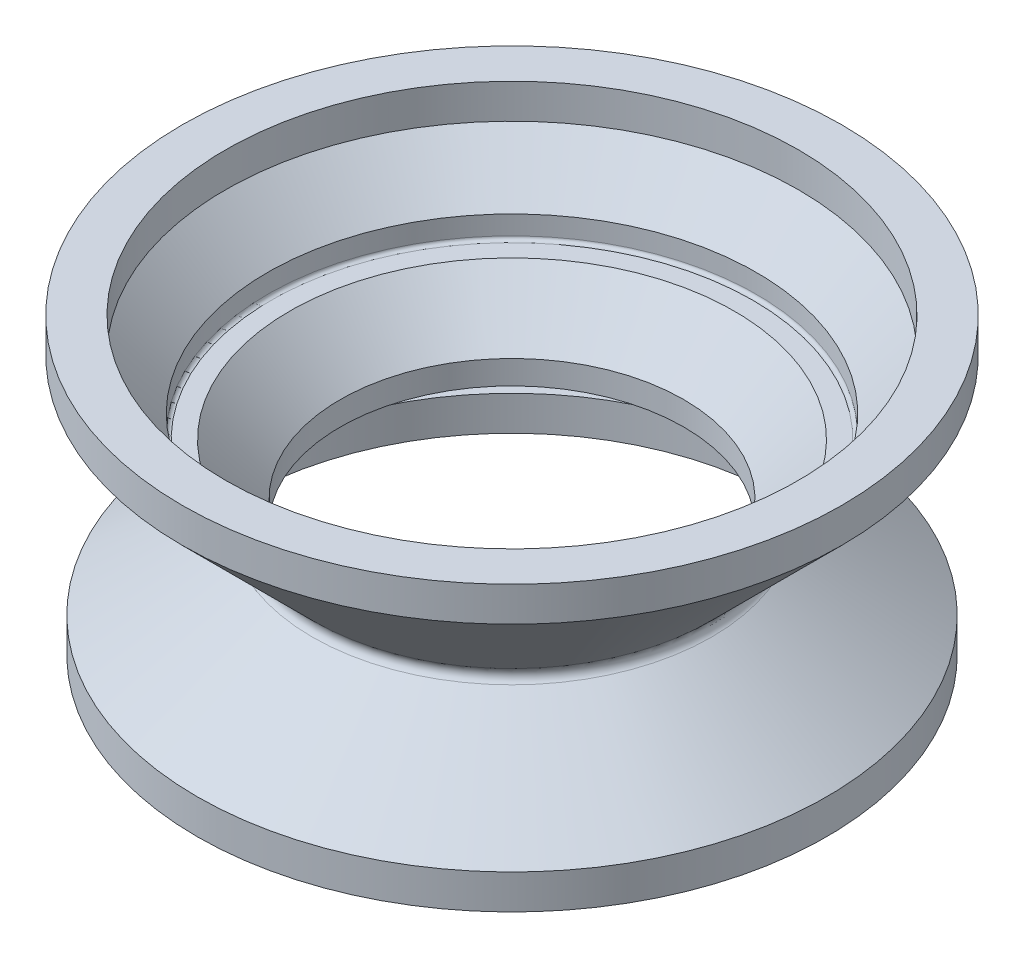
ISO-10303-21;
HEADER;
FILE_DESCRIPTION(('STEP AP214'),'2;1');
FILE_NAME('part.step','',(''),(''),'','','');
FILE_SCHEMA(('AUTOMOTIVE_DESIGN { 1 0 10303 214 1 1 1 1 }'));
ENDSEC;
DATA;
#1=APPLICATION_CONTEXT('core data for automotive mechanical design processes');
#2=APPLICATION_PROTOCOL_DEFINITION('international standard','automotive_design',2000,#1);
#3=PRODUCT_CONTEXT('',#1,'mechanical');
#4=PRODUCT('Part','Part','',(#3));
#5=PRODUCT_RELATED_PRODUCT_CATEGORY('part','',(#4));
#6=PRODUCT_DEFINITION_FORMATION('','',#4);
#7=PRODUCT_DEFINITION_CONTEXT('part definition',#1,'design');
#8=PRODUCT_DEFINITION('design','',#6,#7);
#9=PRODUCT_DEFINITION_SHAPE('','',#8);
#10=(LENGTH_UNIT() NAMED_UNIT(*) SI_UNIT(.MILLI.,.METRE.));
#11=(NAMED_UNIT(*) PLANE_ANGLE_UNIT() SI_UNIT($,.RADIAN.));
#12=(NAMED_UNIT(*) SI_UNIT($,.STERADIAN.) SOLID_ANGLE_UNIT());
#13=UNCERTAINTY_MEASURE_WITH_UNIT(LENGTH_MEASURE(1.E-05),#10,'distance_accuracy_value','');
#14=(GEOMETRIC_REPRESENTATION_CONTEXT(3) GLOBAL_UNCERTAINTY_ASSIGNED_CONTEXT((#13)) GLOBAL_UNIT_ASSIGNED_CONTEXT((#10,
#11,#12)) REPRESENTATION_CONTEXT('',''));
#15=CARTESIAN_POINT('',(0.,0.,0.));
#16=DIRECTION('',(0.,0.,1.));
#17=DIRECTION('',(1.,0.,0.));
#18=AXIS2_PLACEMENT_3D('',#15,#16,#17);
#19=CARTESIAN_POINT('',(0.,8.,0.));
#20=DIRECTION('',(0.,1.,0.));
#21=DIRECTION('',(0.,0.,1.));
#22=AXIS2_PLACEMENT_3D('',#19,#20,#21);
#23=CONICAL_SURFACE('',#22,19.0420064994615,0.785398163397454);
#24=CARTESIAN_POINT('',(0.,0.421348523413396,0.));
#25=DIRECTION('',(0.,1.,0.));
#26=DIRECTION('',(0.,0.,1.));
#27=AXIS2_PLACEMENT_3D('',#24,#25,#26);
#28=CIRCLE('',#27,11.4633550228748);
#29=CARTESIAN_POINT('',(0.,0.421348523413396,11.4633550228748));
#30=VERTEX_POINT('',#29);
#31=EDGE_CURVE('E51',#30,#30,#28,.T.);
#32=ORIENTED_EDGE('',*,*,#31,.T.);
#33=EDGE_LOOP('',(#32));
#34=FACE_BOUND('',#33,.T.);
#35=CARTESIAN_POINT('',(0.,8.,0.));
#36=DIRECTION('',(0.,1.,0.));
#37=DIRECTION('',(0.,0.,1.));
#38=AXIS2_PLACEMENT_3D('',#35,#36,#37);
#39=CIRCLE('',#38,19.0420064994615);
#40=CARTESIAN_POINT('',(0.,8.,19.0420064994615));
#41=VERTEX_POINT('',#40);
#42=EDGE_CURVE('E75',#41,#41,#39,.T.);
#43=ORIENTED_EDGE('',*,*,#42,.F.);
#44=EDGE_LOOP('',(#43));
#45=FACE_BOUND('',#44,.T.);
#46=ADVANCED_FACE('F43',(#34,#45),#23,.T.);
#47=CARTESIAN_POINT('',(0.,0.,0.));
#48=DIRECTION('',(0.,-1.,0.));
#49=DIRECTION('',(0.,0.,-1.));
#50=AXIS2_PLACEMENT_3D('',#47,#48,#49);
#51=CONICAL_SURFACE('',#50,11.0420064994614,0.95993108859688);
#52=CARTESIAN_POINT('',(0.,-0.341780889324378,0.));
#53=DIRECTION('',(0.,-1.,0.));
#54=DIRECTION('',(0.,0.,-1.));
#55=AXIS2_PLACEMENT_3D('',#52,#53,#54);
#56=CIRCLE('',#55,11.5301201952925);
#57=CARTESIAN_POINT('',(0.,-0.341780889324378,-11.5301201952925));
#58=VERTEX_POINT('',#57);
#59=EDGE_CURVE('E10',#58,#58,#56,.T.);
#60=ORIENTED_EDGE('',*,*,#59,.T.);
#61=EDGE_LOOP('',(#60));
#62=FACE_BOUND('',#61,.T.);
#63=CARTESIAN_POINT('',(0.,-5.,0.));
#64=DIRECTION('',(0.,-1.,0.));
#65=DIRECTION('',(0.,0.,-1.));
#66=AXIS2_PLACEMENT_3D('',#63,#64,#65);
#67=CIRCLE('',#66,18.182746533172);
#68=CARTESIAN_POINT('',(0.,-5.,-18.182746533172));
#69=VERTEX_POINT('',#68);
#70=EDGE_CURVE('E124',#69,#69,#67,.T.);
#71=ORIENTED_EDGE('',*,*,#70,.F.);
#72=EDGE_LOOP('',(#71));
#73=FACE_BOUND('',#72,.T.);
#74=ADVANCED_FACE('F160',(#62,#73),#51,.T.);
#75=CARTESIAN_POINT('',(0.,-5.,0.));
#76=DIRECTION('',(0.,-1.,0.));
#77=DIRECTION('',(0.,0.,-1.));
#78=AXIS2_PLACEMENT_3D('',#75,#76,#77);
#79=CONICAL_SURFACE('',#78,16.2649550579887,0.95993108859688);
#80=CARTESIAN_POINT('',(0.,-3.37577562552149,0.));
#81=DIRECTION('',(0.,1.,0.));
#82=DIRECTION('',(0.,0.,1.));
#83=AXIS2_PLACEMENT_3D('',#80,#81,#82);
#84=CIRCLE('',#83,13.9453222550753);
#85=CARTESIAN_POINT('',(0.,-3.37577562552149,13.9453222550753));
#86=VERTEX_POINT('',#85);
#87=EDGE_CURVE('E83',#86,#86,#84,.T.);
#88=ORIENTED_EDGE('',*,*,#87,.T.);
#89=EDGE_LOOP('',(#88));
#90=FACE_BOUND('',#89,.T.);
#91=CARTESIAN_POINT('',(0.,-5.,0.));
#92=DIRECTION('',(0.,1.,0.));
#93=DIRECTION('',(0.,0.,1.));
#94=AXIS2_PLACEMENT_3D('',#91,#92,#93);
#95=CIRCLE('',#94,16.2649550579887);
#96=CARTESIAN_POINT('',(0.,-5.,16.2649550579887));
#97=VERTEX_POINT('',#96);
#98=EDGE_CURVE('E79',#97,#97,#95,.T.);
#99=ORIENTED_EDGE('',*,*,#98,.F.);
#100=EDGE_LOOP('',(#99));
#101=FACE_BOUND('',#100,.T.);
#102=ADVANCED_FACE('F166',(#90,#101),#79,.F.);
#103=CARTESIAN_POINT('',(0.,30.183068269999,0.));
#104=DIRECTION('',(0.,1.,0.));
#105=DIRECTION('',(0.,0.,1.));
#106=AXIS2_PLACEMENT_3D('',#103,#104,#105);
#107=CYLINDRICAL_SURFACE('',#106,13.9453222550753);
#108=CARTESIAN_POINT('',(0.,-2.7607886451969,0.));
#109=DIRECTION('',(0.,-1.,0.));
#110=DIRECTION('',(0.,0.,-1.));
#111=AXIS2_PLACEMENT_3D('',#108,#109,#110);
#112=CIRCLE('',#111,13.9453222550753);
#113=CARTESIAN_POINT('',(0.,-2.7607886451969,-13.9453222550753));
#114=VERTEX_POINT('',#113);
#115=EDGE_CURVE('E61',#114,#114,#112,.F.);
#116=ORIENTED_EDGE('',*,*,#115,.T.);
#117=EDGE_LOOP('',(#116));
#118=FACE_BOUND('',#117,.T.);
#119=ORIENTED_EDGE('',*,*,#87,.F.);
#120=EDGE_LOOP('',(#119));
#121=FACE_BOUND('',#120,.T.);
#122=ADVANCED_FACE('F190',(#118,#121),#107,.F.);
#123=CARTESIAN_POINT('',(-12.9242150242782,-2.66078864519691,0.));
#124=DIRECTION('',(0.,-1.,0.));
#125=DIRECTION('',(0.,0.,-1.));
#126=AXIS2_PLACEMENT_3D('',#123,#124,#125);
#127=PLANE('',#126);
#128=CARTESIAN_POINT('',(0.,-2.66078864519691,0.));
#129=DIRECTION('',(0.,-1.,0.));
#130=DIRECTION('',(0.,0.,-1.));
#131=AXIS2_PLACEMENT_3D('',#128,#129,#130);
#132=CIRCLE('',#131,13.8453222550753);
#133=CARTESIAN_POINT('',(0.,-2.66078864519691,-13.8453222550753));
#134=VERTEX_POINT('',#133);
#135=EDGE_CURVE('E56',#134,#134,#132,.T.);
#136=ORIENTED_EDGE('',*,*,#135,.T.);
#137=EDGE_LOOP('',(#136));
#138=FACE_BOUND('',#137,.T.);
#139=CARTESIAN_POINT('',(0.,-2.66078864519691,0.));
#140=DIRECTION('',(0.,1.,0.));
#141=DIRECTION('',(0.,0.,1.));
#142=AXIS2_PLACEMENT_3D('',#139,#140,#141);
#143=CIRCLE('',#142,12.9242150242782);
#144=CARTESIAN_POINT('',(0.,-2.66078864519691,12.9242150242782));
#145=VERTEX_POINT('',#144);
#146=EDGE_CURVE('E87',#145,#145,#143,.T.);
#147=ORIENTED_EDGE('',*,*,#146,.T.);
#148=EDGE_LOOP('',(#147));
#149=FACE_BOUND('',#148,.T.);
#150=ADVANCED_FACE('F193',(#138,#149),#127,.T.);
#151=CARTESIAN_POINT('',(0.,-2.66078864519691,0.));
#152=DIRECTION('',(0.,-1.,0.));
#153=DIRECTION('',(0.,0.,-1.));
#154=AXIS2_PLACEMENT_3D('',#151,#152,#153);
#155=CONICAL_SURFACE('',#154,12.9242150242782,0.959931088596879);
#156=CARTESIAN_POINT('',(0.,-0.560166030567768,0.));
#157=DIRECTION('',(0.,1.,0.));
#158=DIRECTION('',(0.,0.,1.));
#159=AXIS2_PLACEMENT_3D('',#156,#157,#158);
#160=CIRCLE('',#159,9.92421502427819);
#161=CARTESIAN_POINT('',(0.,-0.560166030567768,9.92421502427819));
#162=VERTEX_POINT('',#161);
#163=EDGE_CURVE('E91',#162,#162,#160,.T.);
#164=ORIENTED_EDGE('',*,*,#163,.T.);
#165=EDGE_LOOP('',(#164));
#166=FACE_BOUND('',#165,.T.);
#167=ORIENTED_EDGE('',*,*,#146,.F.);
#168=EDGE_LOOP('',(#167));
#169=FACE_BOUND('',#168,.T.);
#170=ADVANCED_FACE('F206',(#166,#169),#155,.F.);
#171=CARTESIAN_POINT('',(0.,30.183068269999,0.));
#172=DIRECTION('',(0.,1.,0.));
#173=DIRECTION('',(0.,0.,1.));
#174=AXIS2_PLACEMENT_3D('',#171,#172,#173);
#175=CYLINDRICAL_SURFACE('',#174,9.92421502427819);
#176=CARTESIAN_POINT('',(0.,0.812617411436307,0.));
#177=DIRECTION('',(0.,1.,0.));
#178=DIRECTION('',(0.,0.,1.));
#179=AXIS2_PLACEMENT_3D('',#176,#177,#178);
#180=CIRCLE('',#179,9.92421502427819);
#181=CARTESIAN_POINT('',(0.,0.812617411436307,9.92421502427819));
#182=VERTEX_POINT('',#181);
#183=EDGE_CURVE('E95',#182,#182,#180,.T.);
#184=ORIENTED_EDGE('',*,*,#183,.T.);
#185=EDGE_LOOP('',(#184));
#186=FACE_BOUND('',#185,.T.);
#187=ORIENTED_EDGE('',*,*,#163,.F.);
#188=EDGE_LOOP('',(#187));
#189=FACE_BOUND('',#188,.T.);
#190=ADVANCED_FACE('F209',(#186,#189),#175,.F.);
#191=CARTESIAN_POINT('',(0.,0.812617411436307,0.));
#192=DIRECTION('',(0.,1.,0.));
#193=DIRECTION('',(0.,0.,1.));
#194=AXIS2_PLACEMENT_3D('',#191,#192,#193);
#195=CONICAL_SURFACE('',#194,9.92421502427819,0.777574141477461);
#196=CARTESIAN_POINT('',(0.,3.77814540665911,0.));
#197=DIRECTION('',(0.,1.,0.));
#198=DIRECTION('',(0.,0.,1.));
#199=AXIS2_PLACEMENT_3D('',#196,#197,#198);
#200=CIRCLE('',#199,12.8436976280105);
#201=CARTESIAN_POINT('',(0.,3.77814540665911,12.8436976280105));
#202=VERTEX_POINT('',#201);
#203=EDGE_CURVE('E99',#202,#202,#200,.T.);
#204=ORIENTED_EDGE('',*,*,#203,.T.);
#205=EDGE_LOOP('',(#204));
#206=FACE_BOUND('',#205,.T.);
#207=ORIENTED_EDGE('',*,*,#183,.F.);
#208=EDGE_LOOP('',(#207));
#209=FACE_BOUND('',#208,.T.);
#210=ADVANCED_FACE('F213',(#206,#209),#195,.F.);
#211=CARTESIAN_POINT('',(-12.8436976280105,3.77814540665911,0.));
#212=DIRECTION('',(0.,1.,0.));
#213=DIRECTION('',(0.,0.,1.));
#214=AXIS2_PLACEMENT_3D('',#211,#212,#213);
#215=PLANE('',#214);
#216=CARTESIAN_POINT('',(0.,3.77814540665911,0.));
#217=DIRECTION('',(0.,1.,0.));
#218=DIRECTION('',(0.,0.,1.));
#219=AXIS2_PLACEMENT_3D('',#216,#217,#218);
#220=CIRCLE('',#219,13.9201519061205);
#221=CARTESIAN_POINT('',(0.,3.77814540665911,13.9201519061205));
#222=VERTEX_POINT('',#221);
#223=EDGE_CURVE('E71',#222,#222,#220,.T.);
#224=ORIENTED_EDGE('',*,*,#223,.T.);
#225=EDGE_LOOP('',(#224));
#226=FACE_BOUND('',#225,.T.);
#227=ORIENTED_EDGE('',*,*,#203,.F.);
#228=EDGE_LOOP('',(#227));
#229=FACE_BOUND('',#228,.T.);
#230=ADVANCED_FACE('F217',(#226,#229),#215,.T.);
#231=CARTESIAN_POINT('',(0.,30.183068269999,0.));
#232=DIRECTION('',(0.,1.,0.));
#233=DIRECTION('',(0.,0.,1.));
#234=AXIS2_PLACEMENT_3D('',#231,#232,#233);
#235=CYLINDRICAL_SURFACE('',#234,14.1201519061205);
#236=CARTESIAN_POINT('',(0.,3.9781454066591,0.));
#237=DIRECTION('',(0.,1.,0.));
#238=DIRECTION('',(0.,0.,1.));
#239=AXIS2_PLACEMENT_3D('',#236,#237,#238);
#240=CIRCLE('',#239,14.1201519061205);
#241=CARTESIAN_POINT('',(0.,3.9781454066591,14.1201519061205));
#242=VERTEX_POINT('',#241);
#243=EDGE_CURVE('E67',#242,#242,#240,.F.);
#244=ORIENTED_EDGE('',*,*,#243,.T.);
#245=EDGE_LOOP('',(#244));
#246=FACE_BOUND('',#245,.T.);
#247=CARTESIAN_POINT('',(0.,5.07473162077737,0.));
#248=DIRECTION('',(0.,1.,0.));
#249=DIRECTION('',(0.,0.,1.));
#250=AXIS2_PLACEMENT_3D('',#247,#248,#249);
#251=CIRCLE('',#250,14.1201519061205);
#252=CARTESIAN_POINT('',(0.,5.07473162077737,14.1201519061205));
#253=VERTEX_POINT('',#252);
#254=EDGE_CURVE('E103',#253,#253,#251,.T.);
#255=ORIENTED_EDGE('',*,*,#254,.T.);
#256=EDGE_LOOP('',(#255));
#257=FACE_BOUND('',#256,.T.);
#258=ADVANCED_FACE('F221',(#246,#257),#235,.F.);
#259=CARTESIAN_POINT('',(0.,5.07473162077737,0.));
#260=DIRECTION('',(0.,1.,0.));
#261=DIRECTION('',(0.,0.,1.));
#262=AXIS2_PLACEMENT_3D('',#259,#260,#261);
#263=CONICAL_SURFACE('',#262,14.1201519061205,0.777574141477459);
#264=CARTESIAN_POINT('',(0.,8.,0.));
#265=DIRECTION('',(0.,1.,0.));
#266=DIRECTION('',(0.,0.,1.));
#267=AXIS2_PLACEMENT_3D('',#264,#265,#266);
#268=CIRCLE('',#267,17.);
#269=CARTESIAN_POINT('',(0.,8.,17.));
#270=VERTEX_POINT('',#269);
#271=EDGE_CURVE('E107',#270,#270,#268,.T.);
#272=ORIENTED_EDGE('',*,*,#271,.T.);
#273=EDGE_LOOP('',(#272));
#274=FACE_BOUND('',#273,.T.);
#275=ORIENTED_EDGE('',*,*,#254,.F.);
#276=EDGE_LOOP('',(#275));
#277=FACE_BOUND('',#276,.T.);
#278=ADVANCED_FACE('F174',(#274,#277),#263,.F.);
#279=CARTESIAN_POINT('',(0.,3.9781454066591,0.));
#280=DIRECTION('',(0.,1.,0.));
#281=DIRECTION('',(0.,0.,1.));
#282=AXIS2_PLACEMENT_3D('',#279,#280,#281);
#283=TOROIDAL_SURFACE('',#282,13.9201519061205,0.2);
#284=ORIENTED_EDGE('',*,*,#243,.F.);
#285=EDGE_LOOP('',(#284));
#286=FACE_BOUND('',#285,.T.);
#287=ORIENTED_EDGE('',*,*,#223,.F.);
#288=EDGE_LOOP('',(#287));
#289=FACE_BOUND('',#288,.T.);
#290=ADVANCED_FACE('F171',(#286,#289),#283,.F.);
#291=CARTESIAN_POINT('',(0.,-2.7607886451969,0.));
#292=DIRECTION('',(0.,-1.,0.));
#293=DIRECTION('',(0.,0.,-1.));
#294=AXIS2_PLACEMENT_3D('',#291,#292,#293);
#295=TOROIDAL_SURFACE('',#294,13.8453222550753,0.1);
#296=ORIENTED_EDGE('',*,*,#135,.F.);
#297=EDGE_LOOP('',(#296));
#298=FACE_BOUND('',#297,.T.);
#299=ORIENTED_EDGE('',*,*,#115,.F.);
#300=EDGE_LOOP('',(#299));
#301=FACE_BOUND('',#300,.T.);
#302=ADVANCED_FACE('F173',(#298,#301),#295,.F.);
#303=CARTESIAN_POINT('',(0.,8.,0.));
#304=DIRECTION('',(0.,1.,0.));
#305=DIRECTION('',(0.,0.,1.));
#306=AXIS2_PLACEMENT_3D('',#303,#304,#305);
#307=PLANE('',#306);
#308=CARTESIAN_POINT('',(0.,8.,0.));
#309=DIRECTION('',(0.,1.,0.));
#310=DIRECTION('',(0.,0.,1.));
#311=AXIS2_PLACEMENT_3D('',#308,#309,#310);
#312=CIRCLE('',#311,16.5420064994615);
#313=CARTESIAN_POINT('',(0.,8.,16.5420064994615));
#314=VERTEX_POINT('',#313);
#315=EDGE_CURVE('E116',#314,#314,#312,.T.);
#316=ORIENTED_EDGE('',*,*,#315,.T.);
#317=EDGE_LOOP('',(#316));
#318=FACE_BOUND('',#317,.T.);
#319=ORIENTED_EDGE('',*,*,#271,.F.);
#320=EDGE_LOOP('',(#319));
#321=FACE_BOUND('',#320,.T.);
#322=ADVANCED_FACE('F177',(#318,#321),#307,.F.);
#323=CARTESIAN_POINT('',(0.,10.,0.));
#324=DIRECTION('',(0.,1.,0.));
#325=DIRECTION('',(0.,0.,1.));
#326=AXIS2_PLACEMENT_3D('',#323,#324,#325);
#327=PLANE('',#326);
#328=CARTESIAN_POINT('',(0.,10.,0.));
#329=DIRECTION('',(0.,1.,0.));
#330=DIRECTION('',(0.,0.,1.));
#331=AXIS2_PLACEMENT_3D('',#328,#329,#330);
#332=CIRCLE('',#331,19.0420064994615);
#333=CARTESIAN_POINT('',(0.,10.,19.0420064994615));
#334=VERTEX_POINT('',#333);
#335=EDGE_CURVE('E111',#334,#334,#332,.T.);
#336=ORIENTED_EDGE('',*,*,#335,.T.);
#337=EDGE_LOOP('',(#336));
#338=FACE_BOUND('',#337,.T.);
#339=CARTESIAN_POINT('',(0.,10.,0.));
#340=DIRECTION('',(0.,1.,0.));
#341=DIRECTION('',(0.,0.,1.));
#342=AXIS2_PLACEMENT_3D('',#339,#340,#341);
#343=CIRCLE('',#342,16.5420064994615);
#344=CARTESIAN_POINT('',(0.,10.,16.5420064994615));
#345=VERTEX_POINT('',#344);
#346=EDGE_CURVE('E115',#345,#345,#343,.T.);
#347=ORIENTED_EDGE('',*,*,#346,.F.);
#348=EDGE_LOOP('',(#347));
#349=FACE_BOUND('',#348,.T.);
#350=ADVANCED_FACE('F183',(#338,#349),#327,.T.);
#351=CARTESIAN_POINT('',(0.,10.,0.));
#352=DIRECTION('',(0.,-1.,0.));
#353=DIRECTION('',(0.,0.,-1.));
#354=AXIS2_PLACEMENT_3D('',#351,#352,#353);
#355=CYLINDRICAL_SURFACE('',#354,19.0420064994615);
#356=ORIENTED_EDGE('',*,*,#335,.F.);
#357=EDGE_LOOP('',(#356));
#358=FACE_BOUND('',#357,.T.);
#359=ORIENTED_EDGE('',*,*,#42,.T.);
#360=EDGE_LOOP('',(#359));
#361=FACE_BOUND('',#360,.T.);
#362=ADVANCED_FACE('F229',(#358,#361),#355,.T.);
#363=CARTESIAN_POINT('',(0.,10.,0.));
#364=DIRECTION('',(0.,-1.,0.));
#365=DIRECTION('',(0.,0.,-1.));
#366=AXIS2_PLACEMENT_3D('',#363,#364,#365);
#367=CYLINDRICAL_SURFACE('',#366,16.5420064994615);
#368=ORIENTED_EDGE('',*,*,#346,.T.);
#369=EDGE_LOOP('',(#368));
#370=FACE_BOUND('',#369,.T.);
#371=ORIENTED_EDGE('',*,*,#315,.F.);
#372=EDGE_LOOP('',(#371));
#373=FACE_BOUND('',#372,.T.);
#374=ADVANCED_FACE('F155',(#370,#373),#367,.F.);
#375=CARTESIAN_POINT('',(0.,-5.,0.));
#376=DIRECTION('',(0.,-1.,0.));
#377=DIRECTION('',(0.,0.,-1.));
#378=AXIS2_PLACEMENT_3D('',#375,#376,#377);
#379=PLANE('',#378);
#380=CARTESIAN_POINT('',(0.,-5.,0.));
#381=DIRECTION('',(0.,-1.,0.));
#382=DIRECTION('',(0.,0.,-1.));
#383=AXIS2_PLACEMENT_3D('',#380,#381,#382);
#384=CIRCLE('',#383,15.682746533172);
#385=CARTESIAN_POINT('',(0.,-5.,-15.682746533172));
#386=VERTEX_POINT('',#385);
#387=EDGE_CURVE('E132',#386,#386,#384,.T.);
#388=ORIENTED_EDGE('',*,*,#387,.T.);
#389=EDGE_LOOP('',(#388));
#390=FACE_BOUND('',#389,.T.);
#391=ORIENTED_EDGE('',*,*,#98,.T.);
#392=EDGE_LOOP('',(#391));
#393=FACE_BOUND('',#392,.T.);
#394=ADVANCED_FACE('F146',(#390,#393),#379,.F.);
#395=CARTESIAN_POINT('',(0.,-7.,0.));
#396=DIRECTION('',(0.,-1.,0.));
#397=DIRECTION('',(0.,0.,-1.));
#398=AXIS2_PLACEMENT_3D('',#395,#396,#397);
#399=PLANE('',#398);
#400=CARTESIAN_POINT('',(0.,-7.,0.));
#401=DIRECTION('',(0.,-1.,0.));
#402=DIRECTION('',(0.,0.,-1.));
#403=AXIS2_PLACEMENT_3D('',#400,#401,#402);
#404=CIRCLE('',#403,18.182746533172);
#405=CARTESIAN_POINT('',(0.,-7.,-18.182746533172));
#406=VERTEX_POINT('',#405);
#407=EDGE_CURVE('E120',#406,#406,#404,.T.);
#408=ORIENTED_EDGE('',*,*,#407,.T.);
#409=EDGE_LOOP('',(#408));
#410=FACE_BOUND('',#409,.T.);
#411=CARTESIAN_POINT('',(0.,-7.,0.));
#412=DIRECTION('',(0.,-1.,0.));
#413=DIRECTION('',(0.,0.,-1.));
#414=AXIS2_PLACEMENT_3D('',#411,#412,#413);
#415=CIRCLE('',#414,15.682746533172);
#416=CARTESIAN_POINT('',(0.,-7.,-15.682746533172));
#417=VERTEX_POINT('',#416);
#418=EDGE_CURVE('E128',#417,#417,#415,.T.);
#419=ORIENTED_EDGE('',*,*,#418,.F.);
#420=EDGE_LOOP('',(#419));
#421=FACE_BOUND('',#420,.T.);
#422=ADVANCED_FACE('F143',(#410,#421),#399,.T.);
#423=CARTESIAN_POINT('',(0.,-7.,0.));
#424=DIRECTION('',(0.,1.,0.));
#425=DIRECTION('',(0.,0.,1.));
#426=AXIS2_PLACEMENT_3D('',#423,#424,#425);
#427=CYLINDRICAL_SURFACE('',#426,18.182746533172);
#428=ORIENTED_EDGE('',*,*,#407,.F.);
#429=EDGE_LOOP('',(#428));
#430=FACE_BOUND('',#429,.T.);
#431=ORIENTED_EDGE('',*,*,#70,.T.);
#432=EDGE_LOOP('',(#431));
#433=FACE_BOUND('',#432,.T.);
#434=ADVANCED_FACE('F145',(#430,#433),#427,.T.);
#435=CARTESIAN_POINT('',(0.,-7.,0.));
#436=DIRECTION('',(0.,1.,0.));
#437=DIRECTION('',(0.,0.,1.));
#438=AXIS2_PLACEMENT_3D('',#435,#436,#437);
#439=CYLINDRICAL_SURFACE('',#438,15.682746533172);
#440=ORIENTED_EDGE('',*,*,#418,.T.);
#441=EDGE_LOOP('',(#440));
#442=FACE_BOUND('',#441,.T.);
#443=ORIENTED_EDGE('',*,*,#387,.F.);
#444=EDGE_LOOP('',(#443));
#445=FACE_BOUND('',#444,.T.);
#446=ADVANCED_FACE('F140',(#442,#445),#439,.F.);
#447=CARTESIAN_POINT('',(0.,0.0677951328201211,0.));
#448=DIRECTION('',(0.,1.,0.));
#449=DIRECTION('',(0.,0.,1.));
#450=AXIS2_PLACEMENT_3D('',#447,#448,#449);
#451=TOROIDAL_SURFACE('',#450,11.8169084134681,0.5);
#452=ORIENTED_EDGE('',*,*,#59,.F.);
#453=EDGE_LOOP('',(#452));
#454=FACE_BOUND('',#453,.T.);
#455=ORIENTED_EDGE('',*,*,#31,.F.);
#456=EDGE_LOOP('',(#455));
#457=FACE_BOUND('',#456,.T.);
#458=ADVANCED_FACE('F45',(#454,#457),#451,.F.);
#459=CLOSED_SHELL('',(#46,#74,#102,#122,#150,#170,#190,#210,#230,#258,#278,#290,#302,#322,#350,
#362,#374,#394,#422,#434,#446,#458));
#460=MANIFOLD_SOLID_BREP('B2',#459);
#461=ADVANCED_BREP_SHAPE_REPRESENTATION('',(#18,#460),#14);
#462=SHAPE_DEFINITION_REPRESENTATION(#9,#461);
ENDSEC;
END-ISO-10303-21;
